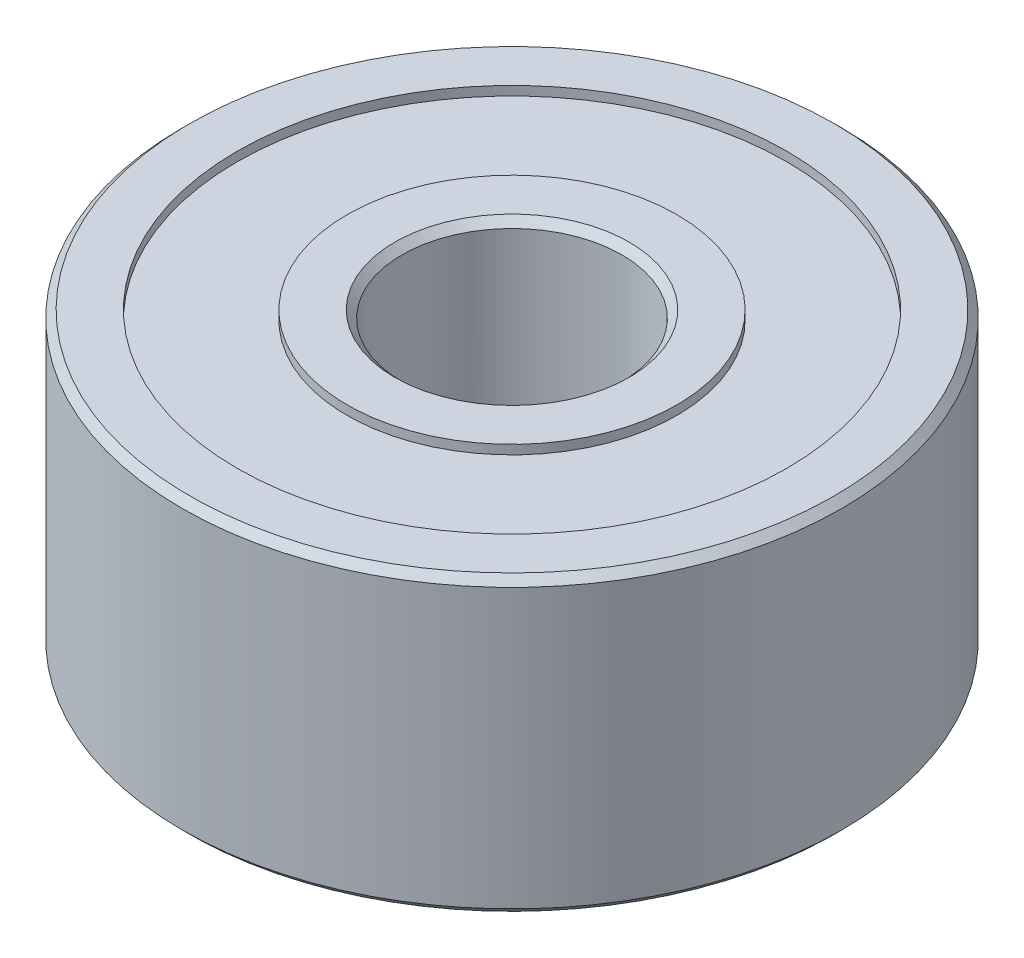
ISO-10303-21;
HEADER;
FILE_DESCRIPTION(('STEP AP214'),'2;1');
FILE_NAME('part.step','',(''),(''),'','','');
FILE_SCHEMA(('AUTOMOTIVE_DESIGN { 1 0 10303 214 1 1 1 1 }'));
ENDSEC;
DATA;
#1=APPLICATION_CONTEXT('core data for automotive mechanical design processes');
#2=APPLICATION_PROTOCOL_DEFINITION('international standard','automotive_design',2000,#1);
#3=PRODUCT_CONTEXT('',#1,'mechanical');
#4=PRODUCT('Part','Part','',(#3));
#5=PRODUCT_RELATED_PRODUCT_CATEGORY('part','',(#4));
#6=PRODUCT_DEFINITION_FORMATION('','',#4);
#7=PRODUCT_DEFINITION_CONTEXT('part definition',#1,'design');
#8=PRODUCT_DEFINITION('design','',#6,#7);
#9=PRODUCT_DEFINITION_SHAPE('','',#8);
#10=(LENGTH_UNIT() NAMED_UNIT(*) SI_UNIT(.MILLI.,.METRE.));
#11=(NAMED_UNIT(*) PLANE_ANGLE_UNIT() SI_UNIT($,.RADIAN.));
#12=(NAMED_UNIT(*) SI_UNIT($,.STERADIAN.) SOLID_ANGLE_UNIT());
#13=UNCERTAINTY_MEASURE_WITH_UNIT(LENGTH_MEASURE(1.E-05),#10,'distance_accuracy_value','');
#14=(GEOMETRIC_REPRESENTATION_CONTEXT(3) GLOBAL_UNCERTAINTY_ASSIGNED_CONTEXT((#13)) GLOBAL_UNIT_ASSIGNED_CONTEXT((#10,
#11,#12)) REPRESENTATION_CONTEXT('',''));
#15=CARTESIAN_POINT('',(0.,0.,0.));
#16=DIRECTION('',(0.,0.,1.));
#17=DIRECTION('',(1.,0.,0.));
#18=AXIS2_PLACEMENT_3D('',#15,#16,#17);
#19=CARTESIAN_POINT('',(2.25,2.,0.));
#20=DIRECTION('',(0.,1.,0.));
#21=DIRECTION('',(0.,0.,1.));
#22=AXIS2_PLACEMENT_3D('',#19,#20,#21);
#23=PLANE('',#22);
#24=CARTESIAN_POINT('',(0.,2.,0.));
#25=DIRECTION('',(0.,1.,0.));
#26=DIRECTION('',(0.,0.,1.));
#27=AXIS2_PLACEMENT_3D('',#24,#25,#26);
#28=CIRCLE('',#27,1.6);
#29=CARTESIAN_POINT('',(0.,2.,1.6));
#30=VERTEX_POINT('',#29);
#31=EDGE_CURVE('E54',#30,#30,#28,.F.);
#32=ORIENTED_EDGE('',*,*,#31,.T.);
#33=EDGE_LOOP('',(#32));
#34=FACE_BOUND('',#33,.T.);
#35=CARTESIAN_POINT('',(0.,2.,0.));
#36=DIRECTION('',(0.,-1.,0.));
#37=DIRECTION('',(0.,0.,-1.));
#38=AXIS2_PLACEMENT_3D('',#35,#36,#37);
#39=CIRCLE('',#38,2.25);
#40=CARTESIAN_POINT('',(0.,2.,-2.25));
#41=VERTEX_POINT('',#40);
#42=EDGE_CURVE('E114',#41,#41,#39,.T.);
#43=ORIENTED_EDGE('',*,*,#42,.F.);
#44=EDGE_LOOP('',(#43));
#45=FACE_BOUND('',#44,.T.);
#46=ADVANCED_FACE('F45',(#34,#45),#23,.T.);
#47=CARTESIAN_POINT('',(0.,-2.,0.));
#48=DIRECTION('',(0.,-1.,0.));
#49=DIRECTION('',(0.,0.,-1.));
#50=AXIS2_PLACEMENT_3D('',#47,#48,#49);
#51=CYLINDRICAL_SURFACE('',#50,1.5);
#52=CARTESIAN_POINT('',(0.,-1.9,0.));
#53=DIRECTION('',(0.,-1.,0.));
#54=DIRECTION('',(0.,0.,-1.));
#55=AXIS2_PLACEMENT_3D('',#52,#53,#54);
#56=CIRCLE('',#55,1.5);
#57=CARTESIAN_POINT('',(0.,-1.9,-1.5));
#58=VERTEX_POINT('',#57);
#59=EDGE_CURVE('E78',#58,#58,#56,.T.);
#60=CARTESIAN_POINT('',(0.,1.9,0.));
#61=DIRECTION('',(0.,1.,0.));
#62=DIRECTION('',(0.,0.,1.));
#63=AXIS2_PLACEMENT_3D('',#60,#61,#62);
#64=CIRCLE('',#63,1.5);
#65=CARTESIAN_POINT('',(0.,1.9,-1.5));
#66=VERTEX_POINT('',#65);
#67=EDGE_CURVE('E82',#66,#66,#64,.T.);
#68=CARTESIAN_POINT('',(0.,-1.9,-1.5));
#69=CARTESIAN_POINT('',(0.,-1.86041666666667,-1.5));
#70=CARTESIAN_POINT('',(0.,-1.82083333333334,-1.5));
#71=CARTESIAN_POINT('',(0.,-1.74166666666667,-1.5));
#72=CARTESIAN_POINT('',(0.,-1.70208333333334,-1.5));
#73=CARTESIAN_POINT('',(0.,-1.62291666666667,-1.5));
#74=CARTESIAN_POINT('',(0.,-1.58333333333334,-1.5));
#75=CARTESIAN_POINT('',(0.,-1.50416666666667,-1.5));
#76=CARTESIAN_POINT('',(0.,-1.46458333333334,-1.5));
#77=CARTESIAN_POINT('',(0.,-1.38541666666667,-1.5));
#78=CARTESIAN_POINT('',(0.,-1.34583333333334,-1.5));
#79=CARTESIAN_POINT('',(0.,-1.26666666666667,-1.5));
#80=CARTESIAN_POINT('',(0.,-1.22708333333334,-1.5));
#81=CARTESIAN_POINT('',(0.,-1.14791666666667,-1.5));
#82=CARTESIAN_POINT('',(0.,-1.10833333333334,-1.5));
#83=CARTESIAN_POINT('',(0.,-1.02916666666667,-1.5));
#84=CARTESIAN_POINT('',(0.,-0.989583333333336,-1.5));
#85=CARTESIAN_POINT('',(0.,-0.91041666666667,-1.5));
#86=CARTESIAN_POINT('',(0.,-0.870833333333336,-1.5));
#87=CARTESIAN_POINT('',(0.,-0.79166666666667,-1.5));
#88=CARTESIAN_POINT('',(0.,-0.752083333333336,-1.5));
#89=CARTESIAN_POINT('',(0.,-0.67291666666667,-1.5));
#90=CARTESIAN_POINT('',(0.,-0.633333333333336,-1.5));
#91=CARTESIAN_POINT('',(0.,-0.554166666666669,-1.5));
#92=CARTESIAN_POINT('',(0.,-0.514583333333336,-1.5));
#93=CARTESIAN_POINT('',(0.,-0.435416666666669,-1.5));
#94=CARTESIAN_POINT('',(0.,-0.395833333333336,-1.5));
#95=CARTESIAN_POINT('',(0.,-0.316666666666669,-1.5));
#96=CARTESIAN_POINT('',(0.,-0.277083333333336,-1.5));
#97=CARTESIAN_POINT('',(0.,-0.197916666666669,-1.5));
#98=CARTESIAN_POINT('',(0.,-0.158333333333336,-1.5));
#99=CARTESIAN_POINT('',(0.,-0.0791666666666692,-1.5));
#100=CARTESIAN_POINT('',(0.,-0.0395833333333359,-1.5));
#101=CARTESIAN_POINT('',(0.,0.0395833333333309,-1.5));
#102=CARTESIAN_POINT('',(0.,0.0791666666666643,-1.5));
#103=CARTESIAN_POINT('',(0.,0.158333333333331,-1.5));
#104=CARTESIAN_POINT('',(0.,0.197916666666664,-1.5));
#105=CARTESIAN_POINT('',(0.,0.277083333333331,-1.5));
#106=CARTESIAN_POINT('',(0.,0.316666666666665,-1.5));
#107=CARTESIAN_POINT('',(0.,0.395833333333331,-1.5));
#108=CARTESIAN_POINT('',(0.,0.435416666666665,-1.5));
#109=CARTESIAN_POINT('',(0.,0.514583333333331,-1.5));
#110=CARTESIAN_POINT('',(0.,0.554166666666665,-1.5));
#111=CARTESIAN_POINT('',(0.,0.633333333333331,-1.5));
#112=CARTESIAN_POINT('',(0.,0.672916666666665,-1.5));
#113=CARTESIAN_POINT('',(0.,0.752083333333332,-1.5));
#114=CARTESIAN_POINT('',(0.,0.791666666666665,-1.5));
#115=CARTESIAN_POINT('',(0.,0.870833333333332,-1.5));
#116=CARTESIAN_POINT('',(0.,0.910416666666665,-1.5));
#117=CARTESIAN_POINT('',(0.,0.989583333333332,-1.5));
#118=CARTESIAN_POINT('',(0.,1.02916666666667,-1.5));
#119=CARTESIAN_POINT('',(0.,1.10833333333333,-1.5));
#120=CARTESIAN_POINT('',(0.,1.14791666666667,-1.5));
#121=CARTESIAN_POINT('',(0.,1.22708333333333,-1.5));
#122=CARTESIAN_POINT('',(0.,1.26666666666667,-1.5));
#123=CARTESIAN_POINT('',(0.,1.34583333333333,-1.5));
#124=CARTESIAN_POINT('',(0.,1.38541666666667,-1.5));
#125=CARTESIAN_POINT('',(0.,1.46458333333333,-1.5));
#126=CARTESIAN_POINT('',(0.,1.50416666666667,-1.5));
#127=CARTESIAN_POINT('',(0.,1.58333333333333,-1.5));
#128=CARTESIAN_POINT('',(0.,1.62291666666667,-1.5));
#129=CARTESIAN_POINT('',(0.,1.70208333333333,-1.5));
#130=CARTESIAN_POINT('',(0.,1.74166666666667,-1.5));
#131=CARTESIAN_POINT('',(0.,1.82083333333333,-1.5));
#132=CARTESIAN_POINT('',(0.,1.86041666666667,-1.5));
#133=CARTESIAN_POINT('',(0.,1.9,-1.5));
#134=B_SPLINE_CURVE_WITH_KNOTS('',3,(#68,#69,#70,#71,#72,#73,#74,#75,#76,#77,#78,#79,#80,#81,
#82,#83,#84,#85,#86,#87,#88,#89,#90,#91,#92,#93,#94,#95,#96,#97,#98,#99,#100,#101,#102,#103,
#104,#105,#106,#107,#108,#109,#110,#111,#112,#113,#114,#115,#116,#117,#118,#119,#120,#121,#122,
#123,#124,#125,#126,#127,#128,#129,#130,#131,#132,#133),.UNSPECIFIED.,.F.,.F.,(4,2,2,2,2,2,2,2,
2,2,2,2,2,2,2,2,2,2,2,2,2,2,2,2,2,2,2,2,2,2,2,2,4),(0.,0.11875,0.2375,0.35625,0.475,0.59375,
0.7125,0.83125,0.950000000000001,1.06875,1.1875,1.30625,1.425,1.54375,1.6625,1.78125,1.9,
2.01875,2.1375,2.25625,2.375,2.49375,2.6125,2.73125,2.85,2.96875,3.0875,3.20625,3.325,3.44375,
3.5625,3.68125,3.8),.UNSPECIFIED.);
#135=EDGE_CURVE('BSEAM123',#58,#66,#134,.T.);
#136=ORIENTED_EDGE('',*,*,#59,.T.);
#137=ORIENTED_EDGE('',*,*,#67,.T.);
#138=ORIENTED_EDGE('',*,*,#135,.T.);
#139=ORIENTED_EDGE('',*,*,#135,.F.);
#140=EDGE_LOOP('',(#136,#138,#137,#139));
#141=FACE_BOUND('',#140,.T.);
#142=ADVANCED_FACE('F123',(#141),#51,.F.);
#143=CARTESIAN_POINT('',(1.5,-2.,0.));
#144=DIRECTION('',(0.,-1.,0.));
#145=DIRECTION('',(0.,0.,-1.));
#146=AXIS2_PLACEMENT_3D('',#143,#144,#145);
#147=PLANE('',#146);
#148=CARTESIAN_POINT('',(0.,-2.,0.));
#149=DIRECTION('',(0.,-1.,0.));
#150=DIRECTION('',(0.,0.,-1.));
#151=AXIS2_PLACEMENT_3D('',#148,#149,#150);
#152=CIRCLE('',#151,1.6);
#153=CARTESIAN_POINT('',(0.,-2.,-1.6));
#154=VERTEX_POINT('',#153);
#155=EDGE_CURVE('E74',#154,#154,#152,.F.);
#156=ORIENTED_EDGE('',*,*,#155,.T.);
#157=EDGE_LOOP('',(#156));
#158=FACE_BOUND('',#157,.T.);
#159=CARTESIAN_POINT('',(0.,-2.,0.));
#160=DIRECTION('',(0.,-1.,0.));
#161=DIRECTION('',(0.,0.,-1.));
#162=AXIS2_PLACEMENT_3D('',#159,#160,#161);
#163=CIRCLE('',#162,2.25);
#164=CARTESIAN_POINT('',(0.,-2.,-2.25));
#165=VERTEX_POINT('',#164);
#166=EDGE_CURVE('E86',#165,#165,#163,.T.);
#167=ORIENTED_EDGE('',*,*,#166,.T.);
#168=EDGE_LOOP('',(#167));
#169=FACE_BOUND('',#168,.T.);
#170=ADVANCED_FACE('F129',(#158,#169),#147,.T.);
#171=CARTESIAN_POINT('',(0.,-2.,0.));
#172=DIRECTION('',(0.,-1.,0.));
#173=DIRECTION('',(0.,0.,-1.));
#174=AXIS2_PLACEMENT_3D('',#171,#172,#173);
#175=CYLINDRICAL_SURFACE('',#174,2.25);
#176=CARTESIAN_POINT('',(0.,-1.875,0.));
#177=DIRECTION('',(0.,-1.,0.));
#178=DIRECTION('',(0.,0.,-1.));
#179=AXIS2_PLACEMENT_3D('',#176,#177,#178);
#180=CIRCLE('',#179,2.25);
#181=CARTESIAN_POINT('',(0.,-1.875,-2.25));
#182=VERTEX_POINT('',#181);
#183=EDGE_CURVE('E90',#182,#182,#180,.T.);
#184=ORIENTED_EDGE('',*,*,#183,.T.);
#185=EDGE_LOOP('',(#184));
#186=FACE_BOUND('',#185,.T.);
#187=ORIENTED_EDGE('',*,*,#166,.F.);
#188=EDGE_LOOP('',(#187));
#189=FACE_BOUND('',#188,.T.);
#190=ADVANCED_FACE('F188',(#186,#189),#175,.T.);
#191=CARTESIAN_POINT('',(2.25,-1.875,0.));
#192=DIRECTION('',(0.,-1.,0.));
#193=DIRECTION('',(0.,0.,-1.));
#194=AXIS2_PLACEMENT_3D('',#191,#192,#193);
#195=PLANE('',#194);
#196=CARTESIAN_POINT('',(0.,-1.875,0.));
#197=DIRECTION('',(0.,-1.,0.));
#198=DIRECTION('',(0.,0.,-1.));
#199=AXIS2_PLACEMENT_3D('',#196,#197,#198);
#200=CIRCLE('',#199,3.75);
#201=CARTESIAN_POINT('',(0.,-1.875,-3.75));
#202=VERTEX_POINT('',#201);
#203=EDGE_CURVE('E94',#202,#202,#200,.T.);
#204=ORIENTED_EDGE('',*,*,#203,.T.);
#205=EDGE_LOOP('',(#204));
#206=FACE_BOUND('',#205,.T.);
#207=ORIENTED_EDGE('',*,*,#183,.F.);
#208=EDGE_LOOP('',(#207));
#209=FACE_BOUND('',#208,.T.);
#210=ADVANCED_FACE('F184',(#206,#209),#195,.T.);
#211=CARTESIAN_POINT('',(0.,-2.,0.));
#212=DIRECTION('',(0.,-1.,0.));
#213=DIRECTION('',(0.,0.,-1.));
#214=AXIS2_PLACEMENT_3D('',#211,#212,#213);
#215=CYLINDRICAL_SURFACE('',#214,3.75);
#216=CARTESIAN_POINT('',(0.,-2.,0.));
#217=DIRECTION('',(0.,-1.,0.));
#218=DIRECTION('',(0.,0.,-1.));
#219=AXIS2_PLACEMENT_3D('',#216,#217,#218);
#220=CIRCLE('',#219,3.75);
#221=CARTESIAN_POINT('',(0.,-2.,-3.75));
#222=VERTEX_POINT('',#221);
#223=EDGE_CURVE('E98',#222,#222,#220,.T.);
#224=ORIENTED_EDGE('',*,*,#223,.T.);
#225=EDGE_LOOP('',(#224));
#226=FACE_BOUND('',#225,.T.);
#227=ORIENTED_EDGE('',*,*,#203,.F.);
#228=EDGE_LOOP('',(#227));
#229=FACE_BOUND('',#228,.T.);
#230=ADVANCED_FACE('F177',(#226,#229),#215,.F.);
#231=CARTESIAN_POINT('',(3.75,-2.,0.));
#232=DIRECTION('',(0.,-1.,0.));
#233=DIRECTION('',(0.,0.,-1.));
#234=AXIS2_PLACEMENT_3D('',#231,#232,#233);
#235=PLANE('',#234);
#236=CARTESIAN_POINT('',(0.,-2.,0.));
#237=DIRECTION('',(0.,-1.,0.));
#238=DIRECTION('',(0.,0.,-1.));
#239=AXIS2_PLACEMENT_3D('',#236,#237,#238);
#240=CIRCLE('',#239,4.4);
#241=CARTESIAN_POINT('',(0.,-2.,-4.4));
#242=VERTEX_POINT('',#241);
#243=EDGE_CURVE('E70',#242,#242,#240,.T.);
#244=ORIENTED_EDGE('',*,*,#243,.T.);
#245=EDGE_LOOP('',(#244));
#246=FACE_BOUND('',#245,.T.);
#247=ORIENTED_EDGE('',*,*,#223,.F.);
#248=EDGE_LOOP('',(#247));
#249=FACE_BOUND('',#248,.T.);
#250=ADVANCED_FACE('F168',(#246,#249),#235,.T.);
#251=CARTESIAN_POINT('',(0.,-2.,0.));
#252=DIRECTION('',(0.,-1.,0.));
#253=DIRECTION('',(0.,0.,-1.));
#254=AXIS2_PLACEMENT_3D('',#251,#252,#253);
#255=CYLINDRICAL_SURFACE('',#254,4.5);
#256=CARTESIAN_POINT('',(0.,-1.9,0.));
#257=DIRECTION('',(0.,-1.,0.));
#258=DIRECTION('',(0.,0.,-1.));
#259=AXIS2_PLACEMENT_3D('',#256,#257,#258);
#260=CIRCLE('',#259,4.5);
#261=CARTESIAN_POINT('',(0.,-1.9,-4.5));
#262=VERTEX_POINT('',#261);
#263=EDGE_CURVE('E59',#262,#262,#260,.F.);
#264=ORIENTED_EDGE('',*,*,#263,.T.);
#265=EDGE_LOOP('',(#264));
#266=FACE_BOUND('',#265,.T.);
#267=CARTESIAN_POINT('',(0.,1.9,0.));
#268=DIRECTION('',(0.,1.,0.));
#269=DIRECTION('',(0.,0.,1.));
#270=AXIS2_PLACEMENT_3D('',#267,#268,#269);
#271=CIRCLE('',#270,4.5);
#272=CARTESIAN_POINT('',(0.,1.9,-4.5));
#273=VERTEX_POINT('',#272);
#274=EDGE_CURVE('E64',#273,#273,#271,.F.);
#275=ORIENTED_EDGE('',*,*,#274,.T.);
#276=EDGE_LOOP('',(#275));
#277=FACE_BOUND('',#276,.T.);
#278=ADVANCED_FACE('F165',(#266,#277),#255,.T.);
#279=CARTESIAN_POINT('',(4.5,2.,0.));
#280=DIRECTION('',(0.,1.,0.));
#281=DIRECTION('',(0.,0.,1.));
#282=AXIS2_PLACEMENT_3D('',#279,#280,#281);
#283=PLANE('',#282);
#284=CARTESIAN_POINT('',(0.,2.,0.));
#285=DIRECTION('',(0.,1.,0.));
#286=DIRECTION('',(0.,0.,1.));
#287=AXIS2_PLACEMENT_3D('',#284,#285,#286);
#288=CIRCLE('',#287,4.4);
#289=CARTESIAN_POINT('',(0.,2.,-4.4));
#290=VERTEX_POINT('',#289);
#291=EDGE_CURVE('E10',#290,#290,#288,.T.);
#292=ORIENTED_EDGE('',*,*,#291,.T.);
#293=EDGE_LOOP('',(#292));
#294=FACE_BOUND('',#293,.T.);
#295=CARTESIAN_POINT('',(0.,2.,0.));
#296=DIRECTION('',(0.,-1.,0.));
#297=DIRECTION('',(0.,0.,-1.));
#298=AXIS2_PLACEMENT_3D('',#295,#296,#297);
#299=CIRCLE('',#298,3.75);
#300=CARTESIAN_POINT('',(0.,2.,-3.75));
#301=VERTEX_POINT('',#300);
#302=EDGE_CURVE('E102',#301,#301,#299,.T.);
#303=ORIENTED_EDGE('',*,*,#302,.T.);
#304=EDGE_LOOP('',(#303));
#305=FACE_BOUND('',#304,.T.);
#306=ADVANCED_FACE('F167',(#294,#305),#283,.T.);
#307=CARTESIAN_POINT('',(0.,-2.,0.));
#308=DIRECTION('',(0.,-1.,0.));
#309=DIRECTION('',(0.,0.,-1.));
#310=AXIS2_PLACEMENT_3D('',#307,#308,#309);
#311=CYLINDRICAL_SURFACE('',#310,3.75);
#312=CARTESIAN_POINT('',(0.,1.875,0.));
#313=DIRECTION('',(0.,-1.,0.));
#314=DIRECTION('',(0.,0.,-1.));
#315=AXIS2_PLACEMENT_3D('',#312,#313,#314);
#316=CIRCLE('',#315,3.75);
#317=CARTESIAN_POINT('',(0.,1.875,-3.75));
#318=VERTEX_POINT('',#317);
#319=EDGE_CURVE('E106',#318,#318,#316,.T.);
#320=ORIENTED_EDGE('',*,*,#319,.T.);
#321=EDGE_LOOP('',(#320));
#322=FACE_BOUND('',#321,.T.);
#323=ORIENTED_EDGE('',*,*,#302,.F.);
#324=EDGE_LOOP('',(#323));
#325=FACE_BOUND('',#324,.T.);
#326=ADVANCED_FACE('F175',(#322,#325),#311,.F.);
#327=CARTESIAN_POINT('',(3.75,1.875,0.));
#328=DIRECTION('',(0.,1.,0.));
#329=DIRECTION('',(0.,0.,1.));
#330=AXIS2_PLACEMENT_3D('',#327,#328,#329);
#331=PLANE('',#330);
#332=CARTESIAN_POINT('',(0.,1.875,0.));
#333=DIRECTION('',(0.,-1.,0.));
#334=DIRECTION('',(0.,0.,-1.));
#335=AXIS2_PLACEMENT_3D('',#332,#333,#334);
#336=CIRCLE('',#335,2.25);
#337=CARTESIAN_POINT('',(0.,1.875,-2.25));
#338=VERTEX_POINT('',#337);
#339=EDGE_CURVE('E110',#338,#338,#336,.T.);
#340=ORIENTED_EDGE('',*,*,#339,.T.);
#341=EDGE_LOOP('',(#340));
#342=FACE_BOUND('',#341,.T.);
#343=ORIENTED_EDGE('',*,*,#319,.F.);
#344=EDGE_LOOP('',(#343));
#345=FACE_BOUND('',#344,.T.);
#346=ADVANCED_FACE('F235',(#342,#345),#331,.T.);
#347=CARTESIAN_POINT('',(0.,-2.,0.));
#348=DIRECTION('',(0.,-1.,0.));
#349=DIRECTION('',(0.,0.,-1.));
#350=AXIS2_PLACEMENT_3D('',#347,#348,#349);
#351=CYLINDRICAL_SURFACE('',#350,2.25);
#352=ORIENTED_EDGE('',*,*,#42,.T.);
#353=EDGE_LOOP('',(#352));
#354=FACE_BOUND('',#353,.T.);
#355=ORIENTED_EDGE('',*,*,#339,.F.);
#356=EDGE_LOOP('',(#355));
#357=FACE_BOUND('',#356,.T.);
#358=ADVANCED_FACE('F119',(#354,#357),#351,.T.);
#359=CARTESIAN_POINT('',(0.,-1.9,0.));
#360=DIRECTION('',(0.,-1.,0.));
#361=DIRECTION('',(0.,0.,-1.));
#362=AXIS2_PLACEMENT_3D('',#359,#360,#361);
#363=CONICAL_SURFACE('',#362,1.5,0.785398163397451);
#364=CARTESIAN_POINT('',(0.,-2.,-1.6));
#365=CARTESIAN_POINT('',(0.,-1.99895833333333,-1.59895833333333));
#366=CARTESIAN_POINT('',(0.,-1.99791666666667,-1.59791666666667));
#367=CARTESIAN_POINT('',(0.,-1.99583333333333,-1.59583333333333));
#368=CARTESIAN_POINT('',(0.,-1.99479166666667,-1.59479166666667));
#369=CARTESIAN_POINT('',(0.,-1.99270833333333,-1.59270833333333));
#370=CARTESIAN_POINT('',(0.,-1.99166666666667,-1.59166666666667));
#371=CARTESIAN_POINT('',(0.,-1.98958333333333,-1.58958333333333));
#372=CARTESIAN_POINT('',(0.,-1.98854166666667,-1.58854166666667));
#373=CARTESIAN_POINT('',(0.,-1.98645833333333,-1.58645833333333));
#374=CARTESIAN_POINT('',(0.,-1.98541666666667,-1.58541666666667));
#375=CARTESIAN_POINT('',(0.,-1.98333333333333,-1.58333333333333));
#376=CARTESIAN_POINT('',(0.,-1.98229166666667,-1.58229166666667));
#377=CARTESIAN_POINT('',(0.,-1.98020833333333,-1.58020833333333));
#378=CARTESIAN_POINT('',(0.,-1.97916666666667,-1.57916666666667));
#379=CARTESIAN_POINT('',(0.,-1.97708333333333,-1.57708333333333));
#380=CARTESIAN_POINT('',(0.,-1.97604166666667,-1.57604166666667));
#381=CARTESIAN_POINT('',(0.,-1.97395833333334,-1.57395833333333));
#382=CARTESIAN_POINT('',(0.,-1.97291666666667,-1.57291666666667));
#383=CARTESIAN_POINT('',(0.,-1.97083333333333,-1.57083333333333));
#384=CARTESIAN_POINT('',(0.,-1.96979166666667,-1.56979166666667));
#385=CARTESIAN_POINT('',(0.,-1.96770833333334,-1.56770833333333));
#386=CARTESIAN_POINT('',(0.,-1.96666666666667,-1.56666666666667));
#387=CARTESIAN_POINT('',(0.,-1.96458333333334,-1.56458333333333));
#388=CARTESIAN_POINT('',(0.,-1.96354166666667,-1.56354166666667));
#389=CARTESIAN_POINT('',(0.,-1.96145833333334,-1.56145833333333));
#390=CARTESIAN_POINT('',(0.,-1.96041666666667,-1.56041666666667));
#391=CARTESIAN_POINT('',(0.,-1.95833333333334,-1.55833333333333));
#392=CARTESIAN_POINT('',(0.,-1.95729166666667,-1.55729166666667));
#393=CARTESIAN_POINT('',(0.,-1.95520833333334,-1.55520833333333));
#394=CARTESIAN_POINT('',(0.,-1.95416666666667,-1.55416666666667));
#395=CARTESIAN_POINT('',(0.,-1.95208333333334,-1.55208333333333));
#396=CARTESIAN_POINT('',(0.,-1.95104166666667,-1.55104166666667));
#397=CARTESIAN_POINT('',(0.,-1.94895833333334,-1.54895833333333));
#398=CARTESIAN_POINT('',(0.,-1.94791666666667,-1.54791666666667));
#399=CARTESIAN_POINT('',(0.,-1.94583333333334,-1.54583333333333));
#400=CARTESIAN_POINT('',(0.,-1.94479166666667,-1.54479166666667));
#401=CARTESIAN_POINT('',(0.,-1.94270833333334,-1.54270833333333));
#402=CARTESIAN_POINT('',(0.,-1.94166666666667,-1.54166666666667));
#403=CARTESIAN_POINT('',(0.,-1.93958333333334,-1.53958333333333));
#404=CARTESIAN_POINT('',(0.,-1.93854166666667,-1.53854166666667));
#405=CARTESIAN_POINT('',(0.,-1.93645833333334,-1.53645833333333));
#406=CARTESIAN_POINT('',(0.,-1.93541666666667,-1.53541666666667));
#407=CARTESIAN_POINT('',(0.,-1.93333333333334,-1.53333333333333));
#408=CARTESIAN_POINT('',(0.,-1.93229166666667,-1.53229166666667));
#409=CARTESIAN_POINT('',(0.,-1.93020833333334,-1.53020833333333));
#410=CARTESIAN_POINT('',(0.,-1.92916666666667,-1.52916666666667));
#411=CARTESIAN_POINT('',(0.,-1.92708333333334,-1.52708333333333));
#412=CARTESIAN_POINT('',(0.,-1.92604166666667,-1.52604166666667));
#413=CARTESIAN_POINT('',(0.,-1.92395833333334,-1.52395833333333));
#414=CARTESIAN_POINT('',(0.,-1.92291666666667,-1.52291666666667));
#415=CARTESIAN_POINT('',(0.,-1.92083333333334,-1.52083333333333));
#416=CARTESIAN_POINT('',(0.,-1.91979166666667,-1.51979166666667));
#417=CARTESIAN_POINT('',(0.,-1.91770833333334,-1.51770833333333));
#418=CARTESIAN_POINT('',(0.,-1.91666666666667,-1.51666666666667));
#419=CARTESIAN_POINT('',(0.,-1.91458333333334,-1.51458333333333));
#420=CARTESIAN_POINT('',(0.,-1.91354166666667,-1.51354166666667));
#421=CARTESIAN_POINT('',(0.,-1.91145833333334,-1.51145833333333));
#422=CARTESIAN_POINT('',(0.,-1.91041666666667,-1.51041666666667));
#423=CARTESIAN_POINT('',(0.,-1.90833333333334,-1.50833333333333));
#424=CARTESIAN_POINT('',(0.,-1.90729166666667,-1.50729166666667));
#425=CARTESIAN_POINT('',(0.,-1.90520833333334,-1.50520833333333));
#426=CARTESIAN_POINT('',(0.,-1.90416666666667,-1.50416666666667));
#427=CARTESIAN_POINT('',(0.,-1.90208333333334,-1.50208333333333));
#428=CARTESIAN_POINT('',(0.,-1.90104166666667,-1.50104166666667));
#429=CARTESIAN_POINT('',(0.,-1.9,-1.5));
#430=B_SPLINE_CURVE_WITH_KNOTS('',3,(#364,#365,#366,#367,#368,#369,#370,#371,#372,#373,#374,
#375,#376,#377,#378,#379,#380,#381,#382,#383,#384,#385,#386,#387,#388,#389,#390,#391,#392,#393,
#394,#395,#396,#397,#398,#399,#400,#401,#402,#403,#404,#405,#406,#407,#408,#409,#410,#411,#412,
#413,#414,#415,#416,#417,#418,#419,#420,#421,#422,#423,#424,#425,#426,#427,#428,#429),
.UNSPECIFIED.,.F.,.F.,(4,2,2,2,2,2,2,2,2,2,2,2,2,2,2,2,2,2,2,2,2,2,2,2,2,2,2,2,2,2,2,2,4),(0.,
0.00441941738241559,0.00883883476483148,0.0132582521472472,0.0176776695296631,
0.0220970869120787,0.0265165042944946,0.0309359216769107,0.0353553390593262,0.0397747564417421,
0.0441941738241577,0.0486135912065738,0.0530330085889894,0.0574524259714053,0.0618718433538208,
0.0662912607362369,0.0707106781186526,0.0751300955010684,0.0795495128834843,0.0839689302659,
0.0883883476483159,0.0928077650307316,0.0972271824131474,0.101646599795563,0.106066017177979,
0.110485434560395,0.114904851942811,0.119324269325226,0.123743686707642,0.128163104090058,
0.132582521472474,0.13700193885489,0.141421356237305),.UNSPECIFIED.);
#431=EDGE_CURVE('BSEAM135',#154,#58,#430,.T.);
#432=ORIENTED_EDGE('',*,*,#155,.F.);
#433=ORIENTED_EDGE('',*,*,#59,.F.);
#434=ORIENTED_EDGE('',*,*,#431,.T.);
#435=ORIENTED_EDGE('',*,*,#431,.F.);
#436=EDGE_LOOP('',(#432,#434,#433,#435));
#437=FACE_BOUND('',#436,.T.);
#438=ADVANCED_FACE('F135',(#437),#363,.F.);
#439=CARTESIAN_POINT('',(0.,-2.,0.));
#440=DIRECTION('',(0.,1.,0.));
#441=DIRECTION('',(0.,0.,1.));
#442=AXIS2_PLACEMENT_3D('',#439,#440,#441);
#443=CONICAL_SURFACE('',#442,4.4,0.785398163397457);
#444=ORIENTED_EDGE('',*,*,#263,.F.);
#445=EDGE_LOOP('',(#444));
#446=FACE_BOUND('',#445,.T.);
#447=ORIENTED_EDGE('',*,*,#243,.F.);
#448=EDGE_LOOP('',(#447));
#449=FACE_BOUND('',#448,.T.);
#450=ADVANCED_FACE('F141',(#446,#449),#443,.T.);
#451=CARTESIAN_POINT('',(0.,2.,0.));
#452=DIRECTION('',(0.,1.,0.));
#453=DIRECTION('',(0.,0.,1.));
#454=AXIS2_PLACEMENT_3D('',#451,#452,#453);
#455=CONICAL_SURFACE('',#454,1.6,0.785398163397456);
#456=ORIENTED_EDGE('',*,*,#67,.F.);
#457=EDGE_LOOP('',(#456));
#458=FACE_BOUND('',#457,.T.);
#459=ORIENTED_EDGE('',*,*,#31,.F.);
#460=EDGE_LOOP('',(#459));
#461=FACE_BOUND('',#460,.T.);
#462=ADVANCED_FACE('F147',(#458,#461),#455,.F.);
#463=CARTESIAN_POINT('',(0.,1.9,0.));
#464=DIRECTION('',(0.,-1.,0.));
#465=DIRECTION('',(0.,0.,-1.));
#466=AXIS2_PLACEMENT_3D('',#463,#464,#465);
#467=CONICAL_SURFACE('',#466,4.5,0.785398163397453);
#468=CARTESIAN_POINT('',(0.,2.,-4.4));
#469=CARTESIAN_POINT('',(0.,1.99895833333333,-4.40104166666667));
#470=CARTESIAN_POINT('',(0.,1.99791666666667,-4.40208333333334));
#471=CARTESIAN_POINT('',(0.,1.99583333333333,-4.40416666666667));
#472=CARTESIAN_POINT('',(0.,1.99479166666667,-4.40520833333334));
#473=CARTESIAN_POINT('',(0.,1.99270833333333,-4.40729166666667));
#474=CARTESIAN_POINT('',(0.,1.99166666666667,-4.40833333333334));
#475=CARTESIAN_POINT('',(0.,1.98958333333333,-4.41041666666667));
#476=CARTESIAN_POINT('',(0.,1.98854166666667,-4.41145833333334));
#477=CARTESIAN_POINT('',(0.,1.98645833333333,-4.41354166666667));
#478=CARTESIAN_POINT('',(0.,1.98541666666667,-4.41458333333334));
#479=CARTESIAN_POINT('',(0.,1.98333333333333,-4.41666666666667));
#480=CARTESIAN_POINT('',(0.,1.98229166666667,-4.41770833333334));
#481=CARTESIAN_POINT('',(0.,1.98020833333333,-4.41979166666667));
#482=CARTESIAN_POINT('',(0.,1.97916666666667,-4.42083333333334));
#483=CARTESIAN_POINT('',(0.,1.97708333333333,-4.42291666666667));
#484=CARTESIAN_POINT('',(0.,1.97604166666667,-4.42395833333334));
#485=CARTESIAN_POINT('',(0.,1.97395833333333,-4.42604166666667));
#486=CARTESIAN_POINT('',(0.,1.97291666666667,-4.42708333333334));
#487=CARTESIAN_POINT('',(0.,1.97083333333333,-4.42916666666667));
#488=CARTESIAN_POINT('',(0.,1.96979166666667,-4.43020833333334));
#489=CARTESIAN_POINT('',(0.,1.96770833333333,-4.43229166666667));
#490=CARTESIAN_POINT('',(0.,1.96666666666667,-4.43333333333334));
#491=CARTESIAN_POINT('',(0.,1.96458333333333,-4.43541666666667));
#492=CARTESIAN_POINT('',(0.,1.96354166666667,-4.43645833333334));
#493=CARTESIAN_POINT('',(0.,1.96145833333333,-4.43854166666667));
#494=CARTESIAN_POINT('',(0.,1.96041666666667,-4.43958333333333));
#495=CARTESIAN_POINT('',(0.,1.95833333333333,-4.44166666666667));
#496=CARTESIAN_POINT('',(0.,1.95729166666667,-4.44270833333334));
#497=CARTESIAN_POINT('',(0.,1.95520833333333,-4.44479166666667));
#498=CARTESIAN_POINT('',(0.,1.95416666666667,-4.44583333333334));
#499=CARTESIAN_POINT('',(0.,1.95208333333333,-4.44791666666667));
#500=CARTESIAN_POINT('',(0.,1.95104166666667,-4.44895833333334));
#501=CARTESIAN_POINT('',(0.,1.94895833333333,-4.45104166666667));
#502=CARTESIAN_POINT('',(0.,1.94791666666667,-4.45208333333334));
#503=CARTESIAN_POINT('',(0.,1.94583333333334,-4.45416666666667));
#504=CARTESIAN_POINT('',(0.,1.94479166666667,-4.45520833333333));
#505=CARTESIAN_POINT('',(0.,1.94270833333334,-4.45729166666667));
#506=CARTESIAN_POINT('',(0.,1.94166666666667,-4.45833333333333));
#507=CARTESIAN_POINT('',(0.,1.93958333333334,-4.46041666666667));
#508=CARTESIAN_POINT('',(0.,1.93854166666667,-4.46145833333333));
#509=CARTESIAN_POINT('',(0.,1.93645833333334,-4.46354166666667));
#510=CARTESIAN_POINT('',(0.,1.93541666666667,-4.46458333333334));
#511=CARTESIAN_POINT('',(0.,1.93333333333334,-4.46666666666667));
#512=CARTESIAN_POINT('',(0.,1.93229166666667,-4.46770833333334));
#513=CARTESIAN_POINT('',(0.,1.93020833333334,-4.46979166666667));
#514=CARTESIAN_POINT('',(0.,1.92916666666667,-4.47083333333333));
#515=CARTESIAN_POINT('',(0.,1.92708333333334,-4.47291666666667));
#516=CARTESIAN_POINT('',(0.,1.92604166666667,-4.47395833333333));
#517=CARTESIAN_POINT('',(0.,1.92395833333334,-4.47604166666667));
#518=CARTESIAN_POINT('',(0.,1.92291666666667,-4.47708333333333));
#519=CARTESIAN_POINT('',(0.,1.92083333333334,-4.47916666666667));
#520=CARTESIAN_POINT('',(0.,1.91979166666667,-4.48020833333333));
#521=CARTESIAN_POINT('',(0.,1.91770833333334,-4.48229166666667));
#522=CARTESIAN_POINT('',(0.,1.91666666666667,-4.48333333333334));
#523=CARTESIAN_POINT('',(0.,1.91458333333334,-4.48541666666667));
#524=CARTESIAN_POINT('',(0.,1.91354166666667,-4.48645833333333));
#525=CARTESIAN_POINT('',(0.,1.91145833333334,-4.48854166666667));
#526=CARTESIAN_POINT('',(0.,1.91041666666667,-4.48958333333333));
#527=CARTESIAN_POINT('',(0.,1.90833333333334,-4.49166666666667));
#528=CARTESIAN_POINT('',(0.,1.90729166666667,-4.49270833333333));
#529=CARTESIAN_POINT('',(0.,1.90520833333334,-4.49479166666667));
#530=CARTESIAN_POINT('',(0.,1.90416666666667,-4.49583333333333));
#531=CARTESIAN_POINT('',(0.,1.90208333333334,-4.49791666666667));
#532=CARTESIAN_POINT('',(0.,1.90104166666667,-4.49895833333333));
#533=CARTESIAN_POINT('',(0.,1.9,-4.5));
#534=B_SPLINE_CURVE_WITH_KNOTS('',3,(#468,#469,#470,#471,#472,#473,#474,#475,#476,#477,#478,
#479,#480,#481,#482,#483,#484,#485,#486,#487,#488,#489,#490,#491,#492,#493,#494,#495,#496,#497,
#498,#499,#500,#501,#502,#503,#504,#505,#506,#507,#508,#509,#510,#511,#512,#513,#514,#515,#516,
#517,#518,#519,#520,#521,#522,#523,#524,#525,#526,#527,#528,#529,#530,#531,#532,#533),
.UNSPECIFIED.,.F.,.F.,(4,2,2,2,2,2,2,2,2,2,2,2,2,2,2,2,2,2,2,2,2,2,2,2,2,2,2,2,2,2,2,2,4),(0.,
0.00441941738241605,0.00883883476483179,0.0132582521472472,0.017677669529663,0.022097086912079,
0.0265165042944948,0.0309359216769102,0.0353553390593266,0.0397747564417423,0.0441941738241577,
0.0486135912065741,0.0530330085889895,0.0574524259714053,0.0618718433538213,0.066291260736237,
0.0707106781186526,0.0751300955010688,0.0795495128834844,0.0839689302659,0.0883883476483156,
0.0928077650307318,0.0972271824131474,0.101646599795563,0.106066017177979,0.110485434560395,
0.114904851942811,0.119324269325227,0.123743686707642,0.128163104090058,0.132582521472474,
0.13700193885489,0.141421356237305),.UNSPECIFIED.);
#535=EDGE_CURVE('BSEAM48',#290,#273,#534,.T.);
#536=ORIENTED_EDGE('',*,*,#291,.F.);
#537=ORIENTED_EDGE('',*,*,#274,.F.);
#538=ORIENTED_EDGE('',*,*,#535,.T.);
#539=ORIENTED_EDGE('',*,*,#535,.F.);
#540=EDGE_LOOP('',(#536,#538,#537,#539));
#541=FACE_BOUND('',#540,.T.);
#542=ADVANCED_FACE('F48',(#541),#467,.T.);
#543=CLOSED_SHELL('',(#46,#142,#170,#190,#210,#230,#250,#278,#306,#326,#346,#358,#438,#450,#462,#542));
#544=MANIFOLD_SOLID_BREP('B2',#543);
#545=ADVANCED_BREP_SHAPE_REPRESENTATION('',(#18,#544),#14);
#546=SHAPE_DEFINITION_REPRESENTATION(#9,#545);
ENDSEC;
END-ISO-10303-21;
